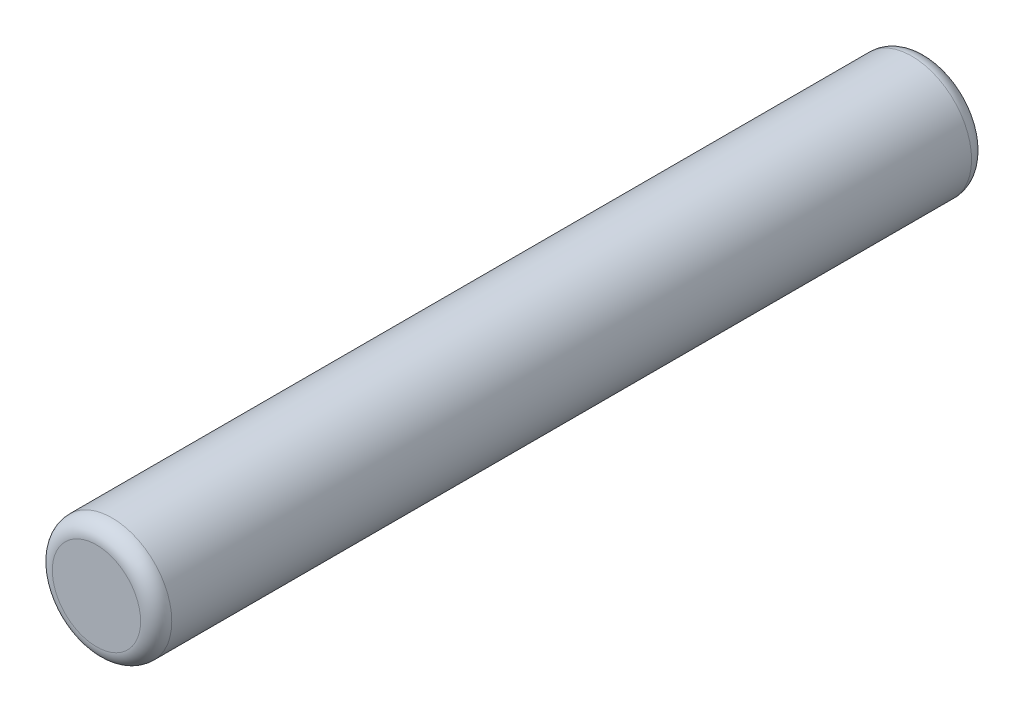
ISO-10303-21;
HEADER;
FILE_DESCRIPTION(('STEP AP214'),'2;1');
FILE_NAME('part.step','',(''),(''),'','','');
FILE_SCHEMA(('AUTOMOTIVE_DESIGN { 1 0 10303 214 1 1 1 1 }'));
ENDSEC;
DATA;
#1=APPLICATION_CONTEXT('core data for automotive mechanical design processes');
#2=APPLICATION_PROTOCOL_DEFINITION('international standard','automotive_design',2000,#1);
#3=PRODUCT_CONTEXT('',#1,'mechanical');
#4=PRODUCT('Part','Part','',(#3));
#5=PRODUCT_RELATED_PRODUCT_CATEGORY('part','',(#4));
#6=PRODUCT_DEFINITION_FORMATION('','',#4);
#7=PRODUCT_DEFINITION_CONTEXT('part definition',#1,'design');
#8=PRODUCT_DEFINITION('design','',#6,#7);
#9=PRODUCT_DEFINITION_SHAPE('','',#8);
#10=(LENGTH_UNIT() NAMED_UNIT(*) SI_UNIT(.MILLI.,.METRE.));
#11=(NAMED_UNIT(*) PLANE_ANGLE_UNIT() SI_UNIT($,.RADIAN.));
#12=(NAMED_UNIT(*) SI_UNIT($,.STERADIAN.) SOLID_ANGLE_UNIT());
#13=UNCERTAINTY_MEASURE_WITH_UNIT(LENGTH_MEASURE(1.E-05),#10,'distance_accuracy_value','');
#14=(GEOMETRIC_REPRESENTATION_CONTEXT(3) GLOBAL_UNCERTAINTY_ASSIGNED_CONTEXT((#13)) GLOBAL_UNIT_ASSIGNED_CONTEXT((#10,
#11,#12)) REPRESENTATION_CONTEXT('',''));
#15=CARTESIAN_POINT('',(0.,0.,0.));
#16=DIRECTION('',(0.,0.,1.));
#17=DIRECTION('',(1.,0.,0.));
#18=AXIS2_PLACEMENT_3D('',#15,#16,#17);
#19=CARTESIAN_POINT('',(0.,0.,16.));
#20=DIRECTION('',(0.,0.,-1.));
#21=DIRECTION('',(-1.,0.,0.));
#22=AXIS2_PLACEMENT_3D('',#19,#20,#21);
#23=CYLINDRICAL_SURFACE('',#22,1.15);
#24=CARTESIAN_POINT('',(0.,0.,0.300000000000002));
#25=DIRECTION('',(0.,0.,1.));
#26=DIRECTION('',(1.,0.,0.));
#27=AXIS2_PLACEMENT_3D('',#24,#25,#26);
#28=CIRCLE('',#27,1.15);
#29=CARTESIAN_POINT('',(1.15,0.,0.300000000000002));
#30=VERTEX_POINT('',#29);
#31=EDGE_CURVE('E42',#30,#30,#28,.T.);
#32=ORIENTED_EDGE('',*,*,#31,.T.);
#33=EDGE_LOOP('',(#32));
#34=FACE_BOUND('',#33,.T.);
#35=CARTESIAN_POINT('',(0.,0.,15.7));
#36=DIRECTION('',(0.,0.,1.));
#37=DIRECTION('',(1.,0.,0.));
#38=AXIS2_PLACEMENT_3D('',#35,#36,#37);
#39=CIRCLE('',#38,1.15);
#40=CARTESIAN_POINT('',(1.15,0.,15.7));
#41=VERTEX_POINT('',#40);
#42=EDGE_CURVE('E46',#41,#41,#39,.F.);
#43=ORIENTED_EDGE('',*,*,#42,.T.);
#44=EDGE_LOOP('',(#43));
#45=FACE_BOUND('',#44,.T.);
#46=ADVANCED_FACE('F31',(#34,#45),#23,.T.);
#47=CARTESIAN_POINT('',(0.,0.,16.));
#48=DIRECTION('',(0.,0.,1.));
#49=DIRECTION('',(1.,0.,0.));
#50=AXIS2_PLACEMENT_3D('',#47,#48,#49);
#51=PLANE('',#50);
#52=CARTESIAN_POINT('',(0.,0.,16.));
#53=DIRECTION('',(0.,0.,1.));
#54=DIRECTION('',(1.,0.,0.));
#55=AXIS2_PLACEMENT_3D('',#52,#53,#54);
#56=CIRCLE('',#55,0.85);
#57=CARTESIAN_POINT('',(0.85,0.,16.));
#58=VERTEX_POINT('',#57);
#59=EDGE_CURVE('E10',#58,#58,#56,.T.);
#60=ORIENTED_EDGE('',*,*,#59,.T.);
#61=EDGE_LOOP('',(#60));
#62=FACE_BOUND('',#61,.T.);
#63=ADVANCED_FACE('F62',(#62),#51,.T.);
#64=CARTESIAN_POINT('',(0.,0.,0.));
#65=DIRECTION('',(0.,0.,1.));
#66=DIRECTION('',(1.,0.,0.));
#67=AXIS2_PLACEMENT_3D('',#64,#65,#66);
#68=PLANE('',#67);
#69=CARTESIAN_POINT('',(0.,0.,0.));
#70=DIRECTION('',(0.,0.,1.));
#71=DIRECTION('',(1.,0.,0.));
#72=AXIS2_PLACEMENT_3D('',#69,#70,#71);
#73=CIRCLE('',#72,0.85);
#74=CARTESIAN_POINT('',(0.85,0.,0.));
#75=VERTEX_POINT('',#74);
#76=EDGE_CURVE('E38',#75,#75,#73,.F.);
#77=ORIENTED_EDGE('',*,*,#76,.T.);
#78=EDGE_LOOP('',(#77));
#79=FACE_BOUND('',#78,.T.);
#80=ADVANCED_FACE('F59',(#79),#68,.F.);
#81=CARTESIAN_POINT('',(0.,0.,0.300000000000002));
#82=DIRECTION('',(0.,0.,1.));
#83=DIRECTION('',(1.,0.,0.));
#84=AXIS2_PLACEMENT_3D('',#81,#82,#83);
#85=TOROIDAL_SURFACE('',#84,0.85,0.3);
#86=ORIENTED_EDGE('',*,*,#76,.F.);
#87=EDGE_LOOP('',(#86));
#88=FACE_BOUND('',#87,.T.);
#89=ORIENTED_EDGE('',*,*,#31,.F.);
#90=EDGE_LOOP('',(#89));
#91=FACE_BOUND('',#90,.T.);
#92=ADVANCED_FACE('F55',(#88,#91),#85,.T.);
#93=CARTESIAN_POINT('',(0.,0.,15.7));
#94=DIRECTION('',(0.,0.,1.));
#95=DIRECTION('',(1.,0.,0.));
#96=AXIS2_PLACEMENT_3D('',#93,#94,#95);
#97=TOROIDAL_SURFACE('',#96,0.85,0.3);
#98=ORIENTED_EDGE('',*,*,#42,.F.);
#99=EDGE_LOOP('',(#98));
#100=FACE_BOUND('',#99,.T.);
#101=ORIENTED_EDGE('',*,*,#59,.F.);
#102=EDGE_LOOP('',(#101));
#103=FACE_BOUND('',#102,.T.);
#104=ADVANCED_FACE('F33',(#100,#103),#97,.T.);
#105=CLOSED_SHELL('',(#46,#63,#80,#92,#104));
#106=MANIFOLD_SOLID_BREP('B2',#105);
#107=ADVANCED_BREP_SHAPE_REPRESENTATION('',(#18,#106),#14);
#108=SHAPE_DEFINITION_REPRESENTATION(#9,#107);
ENDSEC;
END-ISO-10303-21;
